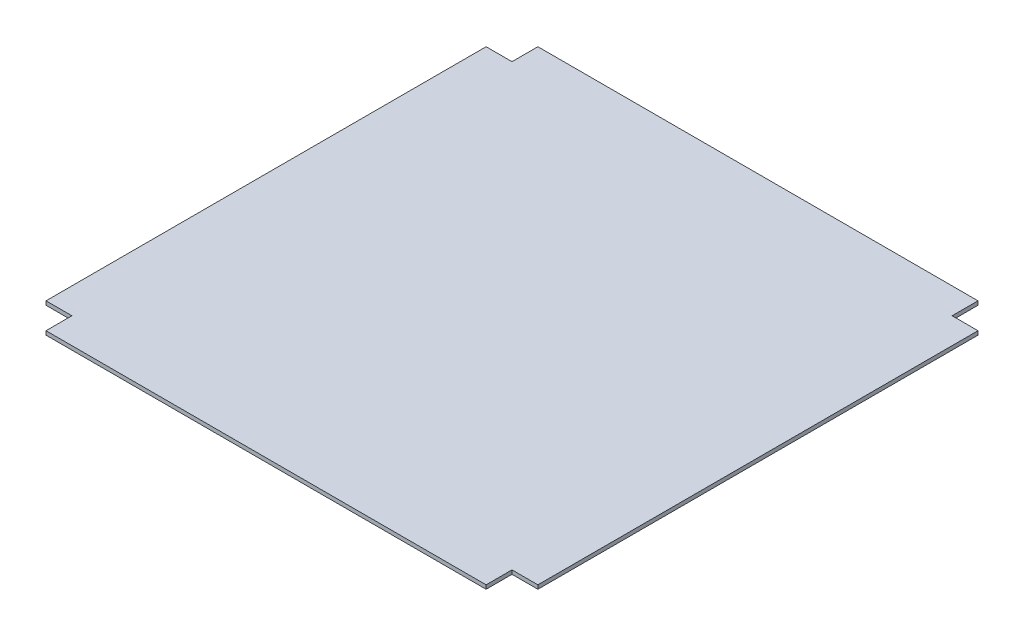
ISO-10303-21;
HEADER;
FILE_DESCRIPTION(('STEP AP214'),'2;1');
FILE_NAME('part.step','',(''),(''),'','','');
FILE_SCHEMA(('AUTOMOTIVE_DESIGN { 1 0 10303 214 1 1 1 1 }'));
ENDSEC;
DATA;
#1=APPLICATION_CONTEXT('core data for automotive mechanical design processes');
#2=APPLICATION_PROTOCOL_DEFINITION('international standard','automotive_design',2000,#1);
#3=PRODUCT_CONTEXT('',#1,'mechanical');
#4=PRODUCT('Part','Part','',(#3));
#5=PRODUCT_RELATED_PRODUCT_CATEGORY('part','',(#4));
#6=PRODUCT_DEFINITION_FORMATION('','',#4);
#7=PRODUCT_DEFINITION_CONTEXT('part definition',#1,'design');
#8=PRODUCT_DEFINITION('design','',#6,#7);
#9=PRODUCT_DEFINITION_SHAPE('','',#8);
#10=(LENGTH_UNIT() NAMED_UNIT(*) SI_UNIT(.MILLI.,.METRE.));
#11=(NAMED_UNIT(*) PLANE_ANGLE_UNIT() SI_UNIT($,.RADIAN.));
#12=(NAMED_UNIT(*) SI_UNIT($,.STERADIAN.) SOLID_ANGLE_UNIT());
#13=UNCERTAINTY_MEASURE_WITH_UNIT(LENGTH_MEASURE(1.E-05),#10,'distance_accuracy_value','');
#14=(GEOMETRIC_REPRESENTATION_CONTEXT(3) GLOBAL_UNCERTAINTY_ASSIGNED_CONTEXT((#13)) GLOBAL_UNIT_ASSIGNED_CONTEXT((#10,
#11,#12)) REPRESENTATION_CONTEXT('',''));
#15=CARTESIAN_POINT('',(0.,0.,0.));
#16=DIRECTION('',(0.,0.,1.));
#17=DIRECTION('',(1.,0.,0.));
#18=AXIS2_PLACEMENT_3D('',#15,#16,#17);
#19=CARTESIAN_POINT('',(-170.,3.,-190.));
#20=DIRECTION('',(0.,0.,1.));
#21=DIRECTION('',(1.,0.,0.));
#22=AXIS2_PLACEMENT_3D('',#19,#20,#21);
#23=PLANE('',#22);
#24=DIRECTION('',(-1.,0.,0.));
#25=VECTOR('',#24,1.);
#26=CARTESIAN_POINT('',(-170.,0.,-190.));
#27=LINE('',#26,#25);
#28=CARTESIAN_POINT('',(170.,0.,-190.));
#29=VERTEX_POINT('',#28);
#30=CARTESIAN_POINT('',(-170.,0.,-190.));
#31=VERTEX_POINT('',#30);
#32=EDGE_CURVE('E157',#29,#31,#27,.T.);
#33=ORIENTED_EDGE('',*,*,#32,.T.);
#34=DIRECTION('',(0.,-1.,0.));
#35=VECTOR('',#34,1.);
#36=CARTESIAN_POINT('',(-170.,3.,-190.));
#37=LINE('',#36,#35);
#38=CARTESIAN_POINT('',(-170.,3.,-190.));
#39=VERTEX_POINT('',#38);
#40=EDGE_CURVE('E11',#39,#31,#37,.T.);
#41=ORIENTED_EDGE('',*,*,#40,.F.);
#42=DIRECTION('',(-1.,0.,0.));
#43=VECTOR('',#42,1.);
#44=CARTESIAN_POINT('',(-170.,3.,-190.));
#45=LINE('',#44,#43);
#46=CARTESIAN_POINT('',(170.,3.,-190.));
#47=VERTEX_POINT('',#46);
#48=EDGE_CURVE('E180',#47,#39,#45,.T.);
#49=ORIENTED_EDGE('',*,*,#48,.F.);
#50=DIRECTION('',(0.,-1.,0.));
#51=VECTOR('',#50,1.);
#52=CARTESIAN_POINT('',(170.,3.,-190.));
#53=LINE('',#52,#51);
#54=EDGE_CURVE('E153',#47,#29,#53,.T.);
#55=ORIENTED_EDGE('',*,*,#54,.T.);
#56=EDGE_LOOP('',(#33,#41,#49,#55));
#57=FACE_BOUND('',#56,.T.);
#58=ADVANCED_FACE('F37',(#57),#23,.F.);
#59=CARTESIAN_POINT('',(-170.,3.,-170.));
#60=DIRECTION('',(1.,0.,0.));
#61=DIRECTION('',(0.,0.,-1.));
#62=AXIS2_PLACEMENT_3D('',#59,#60,#61);
#63=PLANE('',#62);
#64=DIRECTION('',(0.,0.,1.));
#65=VECTOR('',#64,1.);
#66=CARTESIAN_POINT('',(-170.,0.,-170.));
#67=LINE('',#66,#65);
#68=CARTESIAN_POINT('',(-170.,0.,-170.));
#69=VERTEX_POINT('',#68);
#70=EDGE_CURVE('E160',#31,#69,#67,.T.);
#71=ORIENTED_EDGE('',*,*,#70,.T.);
#72=DIRECTION('',(0.,-1.,0.));
#73=VECTOR('',#72,1.);
#74=CARTESIAN_POINT('',(-170.,3.,-170.));
#75=LINE('',#74,#73);
#76=CARTESIAN_POINT('',(-170.,3.,-170.));
#77=VERTEX_POINT('',#76);
#78=EDGE_CURVE('E45',#77,#69,#75,.T.);
#79=ORIENTED_EDGE('',*,*,#78,.F.);
#80=DIRECTION('',(0.,0.,1.));
#81=VECTOR('',#80,1.);
#82=CARTESIAN_POINT('',(-170.,3.,-170.));
#83=LINE('',#82,#81);
#84=EDGE_CURVE('E108',#39,#77,#83,.T.);
#85=ORIENTED_EDGE('',*,*,#84,.F.);
#86=ORIENTED_EDGE('',*,*,#40,.T.);
#87=EDGE_LOOP('',(#71,#79,#85,#86));
#88=FACE_BOUND('',#87,.T.);
#89=ADVANCED_FACE('F258',(#88),#63,.F.);
#90=CARTESIAN_POINT('',(-190.,3.,-170.));
#91=DIRECTION('',(0.,0.,1.));
#92=DIRECTION('',(1.,0.,0.));
#93=AXIS2_PLACEMENT_3D('',#90,#91,#92);
#94=PLANE('',#93);
#95=DIRECTION('',(-1.,0.,0.));
#96=VECTOR('',#95,1.);
#97=CARTESIAN_POINT('',(-190.,0.,-170.));
#98=LINE('',#97,#96);
#99=CARTESIAN_POINT('',(-190.,0.,-170.));
#100=VERTEX_POINT('',#99);
#101=EDGE_CURVE('E163',#69,#100,#98,.T.);
#102=ORIENTED_EDGE('',*,*,#101,.T.);
#103=DIRECTION('',(0.,-1.,0.));
#104=VECTOR('',#103,1.);
#105=CARTESIAN_POINT('',(-190.,3.,-170.));
#106=LINE('',#105,#104);
#107=CARTESIAN_POINT('',(-190.,3.,-170.));
#108=VERTEX_POINT('',#107);
#109=EDGE_CURVE('E199',#108,#100,#106,.T.);
#110=ORIENTED_EDGE('',*,*,#109,.F.);
#111=DIRECTION('',(-1.,0.,0.));
#112=VECTOR('',#111,1.);
#113=CARTESIAN_POINT('',(-190.,3.,-170.));
#114=LINE('',#113,#112);
#115=EDGE_CURVE('E207',#77,#108,#114,.T.);
#116=ORIENTED_EDGE('',*,*,#115,.F.);
#117=ORIENTED_EDGE('',*,*,#78,.T.);
#118=EDGE_LOOP('',(#102,#110,#116,#117));
#119=FACE_BOUND('',#118,.T.);
#120=ADVANCED_FACE('F205',(#119),#94,.F.);
#121=CARTESIAN_POINT('',(-190.,3.,-170.));
#122=DIRECTION('',(1.,0.,0.));
#123=DIRECTION('',(0.,0.,-1.));
#124=AXIS2_PLACEMENT_3D('',#121,#122,#123);
#125=PLANE('',#124);
#126=DIRECTION('',(0.,0.,1.));
#127=VECTOR('',#126,1.);
#128=CARTESIAN_POINT('',(-190.,0.,-170.));
#129=LINE('',#128,#127);
#130=CARTESIAN_POINT('',(-190.,0.,170.));
#131=VERTEX_POINT('',#130);
#132=EDGE_CURVE('E165',#100,#131,#129,.T.);
#133=ORIENTED_EDGE('',*,*,#132,.T.);
#134=DIRECTION('',(0.,-1.,0.));
#135=VECTOR('',#134,1.);
#136=CARTESIAN_POINT('',(-190.,3.,170.));
#137=LINE('',#136,#135);
#138=CARTESIAN_POINT('',(-190.,3.,170.));
#139=VERTEX_POINT('',#138);
#140=EDGE_CURVE('E196',#139,#131,#137,.T.);
#141=ORIENTED_EDGE('',*,*,#140,.F.);
#142=DIRECTION('',(0.,0.,1.));
#143=VECTOR('',#142,1.);
#144=CARTESIAN_POINT('',(-190.,3.,-170.));
#145=LINE('',#144,#143);
#146=EDGE_CURVE('E225',#108,#139,#145,.T.);
#147=ORIENTED_EDGE('',*,*,#146,.F.);
#148=ORIENTED_EDGE('',*,*,#109,.T.);
#149=EDGE_LOOP('',(#133,#141,#147,#148));
#150=FACE_BOUND('',#149,.T.);
#151=ADVANCED_FACE('F216',(#150),#125,.F.);
#152=CARTESIAN_POINT('',(-170.,3.,170.));
#153=DIRECTION('',(0.,0.,-1.));
#154=DIRECTION('',(-1.,0.,0.));
#155=AXIS2_PLACEMENT_3D('',#152,#153,#154);
#156=PLANE('',#155);
#157=DIRECTION('',(1.,0.,0.));
#158=VECTOR('',#157,1.);
#159=CARTESIAN_POINT('',(-170.,0.,170.));
#160=LINE('',#159,#158);
#161=CARTESIAN_POINT('',(-170.,0.,170.));
#162=VERTEX_POINT('',#161);
#163=EDGE_CURVE('E167',#131,#162,#160,.T.);
#164=ORIENTED_EDGE('',*,*,#163,.T.);
#165=DIRECTION('',(0.,-1.,0.));
#166=VECTOR('',#165,1.);
#167=CARTESIAN_POINT('',(-170.,3.,170.));
#168=LINE('',#167,#166);
#169=CARTESIAN_POINT('',(-170.,3.,170.));
#170=VERTEX_POINT('',#169);
#171=EDGE_CURVE('E193',#170,#162,#168,.T.);
#172=ORIENTED_EDGE('',*,*,#171,.F.);
#173=DIRECTION('',(1.,0.,0.));
#174=VECTOR('',#173,1.);
#175=CARTESIAN_POINT('',(-170.,3.,170.));
#176=LINE('',#175,#174);
#177=EDGE_CURVE('E222',#139,#170,#176,.T.);
#178=ORIENTED_EDGE('',*,*,#177,.F.);
#179=ORIENTED_EDGE('',*,*,#140,.T.);
#180=EDGE_LOOP('',(#164,#172,#178,#179));
#181=FACE_BOUND('',#180,.T.);
#182=ADVANCED_FACE('F220',(#181),#156,.F.);
#183=CARTESIAN_POINT('',(-170.,3.,190.));
#184=DIRECTION('',(1.,0.,0.));
#185=DIRECTION('',(0.,0.,-1.));
#186=AXIS2_PLACEMENT_3D('',#183,#184,#185);
#187=PLANE('',#186);
#188=DIRECTION('',(0.,0.,1.));
#189=VECTOR('',#188,1.);
#190=CARTESIAN_POINT('',(-170.,0.,190.));
#191=LINE('',#190,#189);
#192=CARTESIAN_POINT('',(-170.,0.,190.));
#193=VERTEX_POINT('',#192);
#194=EDGE_CURVE('E169',#162,#193,#191,.T.);
#195=ORIENTED_EDGE('',*,*,#194,.T.);
#196=DIRECTION('',(0.,-1.,0.));
#197=VECTOR('',#196,1.);
#198=CARTESIAN_POINT('',(-170.,3.,190.));
#199=LINE('',#198,#197);
#200=CARTESIAN_POINT('',(-170.,3.,190.));
#201=VERTEX_POINT('',#200);
#202=EDGE_CURVE('E190',#201,#193,#199,.T.);
#203=ORIENTED_EDGE('',*,*,#202,.F.);
#204=DIRECTION('',(0.,0.,1.));
#205=VECTOR('',#204,1.);
#206=CARTESIAN_POINT('',(-170.,3.,190.));
#207=LINE('',#206,#205);
#208=EDGE_CURVE('E224',#170,#201,#207,.T.);
#209=ORIENTED_EDGE('',*,*,#208,.F.);
#210=ORIENTED_EDGE('',*,*,#171,.T.);
#211=EDGE_LOOP('',(#195,#203,#209,#210));
#212=FACE_BOUND('',#211,.T.);
#213=ADVANCED_FACE('F271',(#212),#187,.F.);
#214=CARTESIAN_POINT('',(-170.,3.,190.));
#215=DIRECTION('',(0.,0.,-1.));
#216=DIRECTION('',(-1.,0.,0.));
#217=AXIS2_PLACEMENT_3D('',#214,#215,#216);
#218=PLANE('',#217);
#219=DIRECTION('',(1.,0.,0.));
#220=VECTOR('',#219,1.);
#221=CARTESIAN_POINT('',(-170.,0.,190.));
#222=LINE('',#221,#220);
#223=CARTESIAN_POINT('',(170.,0.,190.));
#224=VERTEX_POINT('',#223);
#225=EDGE_CURVE('E171',#193,#224,#222,.T.);
#226=ORIENTED_EDGE('',*,*,#225,.T.);
#227=DIRECTION('',(0.,-1.,0.));
#228=VECTOR('',#227,1.);
#229=CARTESIAN_POINT('',(170.,3.,190.));
#230=LINE('',#229,#228);
#231=CARTESIAN_POINT('',(170.,3.,190.));
#232=VERTEX_POINT('',#231);
#233=EDGE_CURVE('E187',#232,#224,#230,.T.);
#234=ORIENTED_EDGE('',*,*,#233,.F.);
#235=DIRECTION('',(1.,0.,0.));
#236=VECTOR('',#235,1.);
#237=CARTESIAN_POINT('',(-170.,3.,190.));
#238=LINE('',#237,#236);
#239=EDGE_CURVE('E227',#201,#232,#238,.T.);
#240=ORIENTED_EDGE('',*,*,#239,.F.);
#241=ORIENTED_EDGE('',*,*,#202,.T.);
#242=EDGE_LOOP('',(#226,#234,#240,#241));
#243=FACE_BOUND('',#242,.T.);
#244=ADVANCED_FACE('F274',(#243),#218,.F.);
#245=CARTESIAN_POINT('',(170.,3.,170.));
#246=DIRECTION('',(-1.,0.,0.));
#247=DIRECTION('',(0.,0.,1.));
#248=AXIS2_PLACEMENT_3D('',#245,#246,#247);
#249=PLANE('',#248);
#250=DIRECTION('',(0.,0.,-1.));
#251=VECTOR('',#250,1.);
#252=CARTESIAN_POINT('',(170.,0.,170.));
#253=LINE('',#252,#251);
#254=CARTESIAN_POINT('',(170.,0.,170.));
#255=VERTEX_POINT('',#254);
#256=EDGE_CURVE('E173',#224,#255,#253,.T.);
#257=ORIENTED_EDGE('',*,*,#256,.T.);
#258=DIRECTION('',(0.,-1.,0.));
#259=VECTOR('',#258,1.);
#260=CARTESIAN_POINT('',(170.,3.,170.));
#261=LINE('',#260,#259);
#262=CARTESIAN_POINT('',(170.,3.,170.));
#263=VERTEX_POINT('',#262);
#264=EDGE_CURVE('E184',#263,#255,#261,.T.);
#265=ORIENTED_EDGE('',*,*,#264,.F.);
#266=DIRECTION('',(0.,0.,-1.));
#267=VECTOR('',#266,1.);
#268=CARTESIAN_POINT('',(170.,3.,170.));
#269=LINE('',#268,#267);
#270=EDGE_CURVE('E233',#232,#263,#269,.T.);
#271=ORIENTED_EDGE('',*,*,#270,.F.);
#272=ORIENTED_EDGE('',*,*,#233,.T.);
#273=EDGE_LOOP('',(#257,#265,#271,#272));
#274=FACE_BOUND('',#273,.T.);
#275=ADVANCED_FACE('F239',(#274),#249,.F.);
#276=CARTESIAN_POINT('',(190.,3.,170.));
#277=DIRECTION('',(0.,0.,-1.));
#278=DIRECTION('',(-1.,0.,0.));
#279=AXIS2_PLACEMENT_3D('',#276,#277,#278);
#280=PLANE('',#279);
#281=DIRECTION('',(1.,0.,0.));
#282=VECTOR('',#281,1.);
#283=CARTESIAN_POINT('',(190.,0.,170.));
#284=LINE('',#283,#282);
#285=CARTESIAN_POINT('',(190.,0.,170.));
#286=VERTEX_POINT('',#285);
#287=EDGE_CURVE('E175',#255,#286,#284,.T.);
#288=ORIENTED_EDGE('',*,*,#287,.T.);
#289=DIRECTION('',(0.,-1.,0.));
#290=VECTOR('',#289,1.);
#291=CARTESIAN_POINT('',(190.,3.,170.));
#292=LINE('',#291,#290);
#293=CARTESIAN_POINT('',(190.,3.,170.));
#294=VERTEX_POINT('',#293);
#295=EDGE_CURVE('E148',#294,#286,#292,.T.);
#296=ORIENTED_EDGE('',*,*,#295,.F.);
#297=DIRECTION('',(1.,0.,0.));
#298=VECTOR('',#297,1.);
#299=CARTESIAN_POINT('',(190.,3.,170.));
#300=LINE('',#299,#298);
#301=EDGE_CURVE('E139',#263,#294,#300,.T.);
#302=ORIENTED_EDGE('',*,*,#301,.F.);
#303=ORIENTED_EDGE('',*,*,#264,.T.);
#304=EDGE_LOOP('',(#288,#296,#302,#303));
#305=FACE_BOUND('',#304,.T.);
#306=ADVANCED_FACE('F243',(#305),#280,.F.);
#307=CARTESIAN_POINT('',(190.,3.,-170.));
#308=DIRECTION('',(-1.,0.,0.));
#309=DIRECTION('',(0.,0.,1.));
#310=AXIS2_PLACEMENT_3D('',#307,#308,#309);
#311=PLANE('',#310);
#312=DIRECTION('',(0.,0.,-1.));
#313=VECTOR('',#312,1.);
#314=CARTESIAN_POINT('',(190.,0.,-170.));
#315=LINE('',#314,#313);
#316=CARTESIAN_POINT('',(190.,0.,-170.));
#317=VERTEX_POINT('',#316);
#318=EDGE_CURVE('E147',#286,#317,#315,.T.);
#319=ORIENTED_EDGE('',*,*,#318,.T.);
#320=DIRECTION('',(0.,-1.,0.));
#321=VECTOR('',#320,1.);
#322=CARTESIAN_POINT('',(190.,3.,-170.));
#323=LINE('',#322,#321);
#324=CARTESIAN_POINT('',(190.,3.,-170.));
#325=VERTEX_POINT('',#324);
#326=EDGE_CURVE('E144',#325,#317,#323,.T.);
#327=ORIENTED_EDGE('',*,*,#326,.F.);
#328=DIRECTION('',(0.,0.,-1.));
#329=VECTOR('',#328,1.);
#330=CARTESIAN_POINT('',(190.,3.,-170.));
#331=LINE('',#330,#329);
#332=EDGE_CURVE('E133',#294,#325,#331,.T.);
#333=ORIENTED_EDGE('',*,*,#332,.F.);
#334=ORIENTED_EDGE('',*,*,#295,.T.);
#335=EDGE_LOOP('',(#319,#327,#333,#334));
#336=FACE_BOUND('',#335,.T.);
#337=ADVANCED_FACE('F145',(#336),#311,.F.);
#338=CARTESIAN_POINT('',(170.,3.,-170.));
#339=DIRECTION('',(0.,0.,1.));
#340=DIRECTION('',(1.,0.,0.));
#341=AXIS2_PLACEMENT_3D('',#338,#339,#340);
#342=PLANE('',#341);
#343=DIRECTION('',(-1.,0.,0.));
#344=VECTOR('',#343,1.);
#345=CARTESIAN_POINT('',(170.,0.,-170.));
#346=LINE('',#345,#344);
#347=CARTESIAN_POINT('',(170.,0.,-170.));
#348=VERTEX_POINT('',#347);
#349=EDGE_CURVE('E94',#317,#348,#346,.T.);
#350=ORIENTED_EDGE('',*,*,#349,.T.);
#351=DIRECTION('',(0.,-1.,0.));
#352=VECTOR('',#351,1.);
#353=CARTESIAN_POINT('',(170.,3.,-170.));
#354=LINE('',#353,#352);
#355=CARTESIAN_POINT('',(170.,3.,-170.));
#356=VERTEX_POINT('',#355);
#357=EDGE_CURVE('E149',#356,#348,#354,.T.);
#358=ORIENTED_EDGE('',*,*,#357,.F.);
#359=DIRECTION('',(-1.,0.,0.));
#360=VECTOR('',#359,1.);
#361=CARTESIAN_POINT('',(170.,3.,-170.));
#362=LINE('',#361,#360);
#363=EDGE_CURVE('E137',#325,#356,#362,.T.);
#364=ORIENTED_EDGE('',*,*,#363,.F.);
#365=ORIENTED_EDGE('',*,*,#326,.T.);
#366=EDGE_LOOP('',(#350,#358,#364,#365));
#367=FACE_BOUND('',#366,.T.);
#368=ADVANCED_FACE('F151',(#367),#342,.F.);
#369=CARTESIAN_POINT('',(170.,3.,-190.));
#370=DIRECTION('',(-1.,0.,0.));
#371=DIRECTION('',(0.,0.,1.));
#372=AXIS2_PLACEMENT_3D('',#369,#370,#371);
#373=PLANE('',#372);
#374=DIRECTION('',(0.,0.,-1.));
#375=VECTOR('',#374,1.);
#376=CARTESIAN_POINT('',(170.,0.,-190.));
#377=LINE('',#376,#375);
#378=EDGE_CURVE('E100',#348,#29,#377,.T.);
#379=ORIENTED_EDGE('',*,*,#378,.T.);
#380=ORIENTED_EDGE('',*,*,#54,.F.);
#381=DIRECTION('',(0.,0.,-1.));
#382=VECTOR('',#381,1.);
#383=CARTESIAN_POINT('',(170.,3.,-190.));
#384=LINE('',#383,#382);
#385=EDGE_CURVE('E53',#356,#47,#384,.T.);
#386=ORIENTED_EDGE('',*,*,#385,.F.);
#387=ORIENTED_EDGE('',*,*,#357,.T.);
#388=EDGE_LOOP('',(#379,#380,#386,#387));
#389=FACE_BOUND('',#388,.T.);
#390=ADVANCED_FACE('F247',(#389),#373,.F.);
#391=CARTESIAN_POINT('',(0.,3.,0.));
#392=DIRECTION('',(0.,-1.,0.));
#393=DIRECTION('',(0.,0.,-1.));
#394=AXIS2_PLACEMENT_3D('',#391,#392,#393);
#395=PLANE('',#394);
#396=ORIENTED_EDGE('',*,*,#48,.T.);
#397=ORIENTED_EDGE('',*,*,#84,.T.);
#398=ORIENTED_EDGE('',*,*,#115,.T.);
#399=ORIENTED_EDGE('',*,*,#146,.T.);
#400=ORIENTED_EDGE('',*,*,#177,.T.);
#401=ORIENTED_EDGE('',*,*,#208,.T.);
#402=ORIENTED_EDGE('',*,*,#239,.T.);
#403=ORIENTED_EDGE('',*,*,#270,.T.);
#404=ORIENTED_EDGE('',*,*,#301,.T.);
#405=ORIENTED_EDGE('',*,*,#332,.T.);
#406=ORIENTED_EDGE('',*,*,#363,.T.);
#407=ORIENTED_EDGE('',*,*,#385,.T.);
#408=EDGE_LOOP('',(#396,#397,#398,#399,#400,#401,#402,#403,#404,#405,#406,#407));
#409=FACE_BOUND('',#408,.T.);
#410=ADVANCED_FACE('F135',(#409),#395,.F.);
#411=CARTESIAN_POINT('',(0.,0.,0.));
#412=DIRECTION('',(0.,-1.,0.));
#413=DIRECTION('',(0.,0.,-1.));
#414=AXIS2_PLACEMENT_3D('',#411,#412,#413);
#415=PLANE('',#414);
#416=CARTESIAN_POINT('',(0.,0.,0.));
#417=DIRECTION('',(0.,-1.,0.));
#418=DIRECTION('',(0.,0.,-1.));
#419=AXIS2_PLACEMENT_3D('',#416,#417,#418);
#420=CIRCLE('',#419,15.);
#421=CARTESIAN_POINT('',(0.,0.,-15.));
#422=VERTEX_POINT('',#421);
#423=EDGE_CURVE('E418',#422,#422,#420,.T.);
#424=ORIENTED_EDGE('',*,*,#423,.F.);
#425=EDGE_LOOP('',(#424));
#426=FACE_BOUND('',#425,.T.);
#427=ORIENTED_EDGE('',*,*,#32,.F.);
#428=ORIENTED_EDGE('',*,*,#378,.F.);
#429=ORIENTED_EDGE('',*,*,#349,.F.);
#430=ORIENTED_EDGE('',*,*,#318,.F.);
#431=ORIENTED_EDGE('',*,*,#287,.F.);
#432=ORIENTED_EDGE('',*,*,#256,.F.);
#433=ORIENTED_EDGE('',*,*,#225,.F.);
#434=ORIENTED_EDGE('',*,*,#194,.F.);
#435=ORIENTED_EDGE('',*,*,#163,.F.);
#436=ORIENTED_EDGE('',*,*,#132,.F.);
#437=ORIENTED_EDGE('',*,*,#101,.F.);
#438=ORIENTED_EDGE('',*,*,#70,.F.);
#439=EDGE_LOOP('',(#427,#428,#429,#430,#431,#432,#433,#434,#435,#436,#437,#438));
#440=FACE_BOUND('',#439,.T.);
#441=ADVANCED_FACE('F211',(#426,#440),#415,.T.);
#442=CARTESIAN_POINT('',(0.,-1.,0.));
#443=DIRECTION('',(0.,1.,0.));
#444=DIRECTION('',(0.,0.,1.));
#445=AXIS2_PLACEMENT_3D('',#442,#443,#444);
#446=CYLINDRICAL_SURFACE('',#445,15.);
#447=CARTESIAN_POINT('',(0.,-1.,0.));
#448=DIRECTION('',(0.,-1.,0.));
#449=DIRECTION('',(0.,0.,-1.));
#450=AXIS2_PLACEMENT_3D('',#447,#448,#449);
#451=CIRCLE('',#450,15.);
#452=CARTESIAN_POINT('',(0.,-1.,-15.));
#453=VERTEX_POINT('',#452);
#454=EDGE_CURVE('E161',#453,#453,#451,.T.);
#455=ORIENTED_EDGE('',*,*,#454,.F.);
#456=EDGE_LOOP('',(#455));
#457=FACE_BOUND('',#456,.T.);
#458=ORIENTED_EDGE('',*,*,#423,.T.);
#459=EDGE_LOOP('',(#458));
#460=FACE_BOUND('',#459,.T.);
#461=ADVANCED_FACE('F314',(#457,#460),#446,.T.);
#462=CARTESIAN_POINT('',(0.,-1.,0.));
#463=DIRECTION('',(0.,-1.,0.));
#464=DIRECTION('',(0.,0.,-1.));
#465=AXIS2_PLACEMENT_3D('',#462,#463,#464);
#466=PLANE('',#465);
#467=ORIENTED_EDGE('',*,*,#454,.T.);
#468=EDGE_LOOP('',(#467));
#469=FACE_BOUND('',#468,.T.);
#470=ADVANCED_FACE('F324',(#469),#466,.T.);
#471=CLOSED_SHELL('',(#58,#89,#120,#151,#182,#213,#244,#275,#306,#337,#368,#390,#410,#441,#461,#470));
#472=MANIFOLD_SOLID_BREP('B2',#471);
#473=ADVANCED_BREP_SHAPE_REPRESENTATION('',(#18,#472),#14);
#474=SHAPE_DEFINITION_REPRESENTATION(#9,#473);
ENDSEC;
END-ISO-10303-21;
